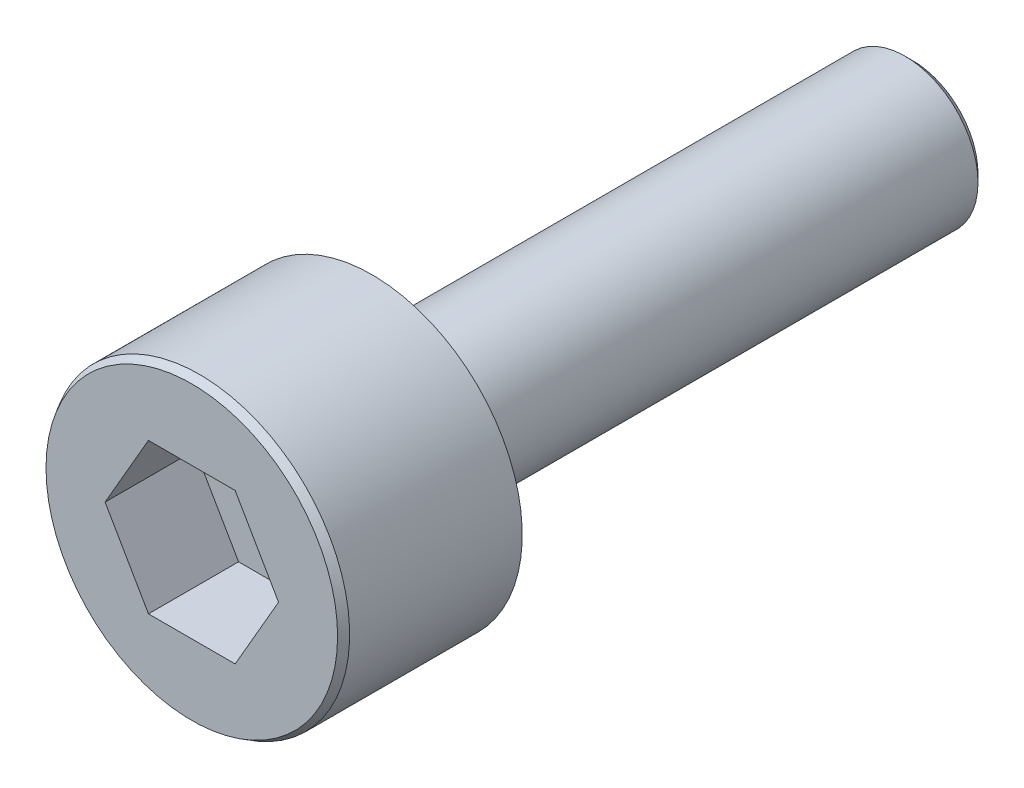
ISO-10303-21;
HEADER;
FILE_DESCRIPTION(('STEP AP214'),'2;1');
FILE_NAME('part.step','',(''),(''),'','','');
FILE_SCHEMA(('AUTOMOTIVE_DESIGN { 1 0 10303 214 1 1 1 1 }'));
ENDSEC;
DATA;
#1=APPLICATION_CONTEXT('core data for automotive mechanical design processes');
#2=APPLICATION_PROTOCOL_DEFINITION('international standard','automotive_design',2000,#1);
#3=PRODUCT_CONTEXT('',#1,'mechanical');
#4=PRODUCT('Part','Part','',(#3));
#5=PRODUCT_RELATED_PRODUCT_CATEGORY('part','',(#4));
#6=PRODUCT_DEFINITION_FORMATION('','',#4);
#7=PRODUCT_DEFINITION_CONTEXT('part definition',#1,'design');
#8=PRODUCT_DEFINITION('design','',#6,#7);
#9=PRODUCT_DEFINITION_SHAPE('','',#8);
#10=(LENGTH_UNIT() NAMED_UNIT(*) SI_UNIT(.MILLI.,.METRE.));
#11=(NAMED_UNIT(*) PLANE_ANGLE_UNIT() SI_UNIT($,.RADIAN.));
#12=(NAMED_UNIT(*) SI_UNIT($,.STERADIAN.) SOLID_ANGLE_UNIT());
#13=UNCERTAINTY_MEASURE_WITH_UNIT(LENGTH_MEASURE(1.E-05),#10,'distance_accuracy_value','');
#14=(GEOMETRIC_REPRESENTATION_CONTEXT(3) GLOBAL_UNCERTAINTY_ASSIGNED_CONTEXT((#13)) GLOBAL_UNIT_ASSIGNED_CONTEXT((#10,
#11,#12)) REPRESENTATION_CONTEXT('',''));
#15=CARTESIAN_POINT('',(0.,0.,0.));
#16=DIRECTION('',(0.,0.,1.));
#17=DIRECTION('',(1.,0.,0.));
#18=AXIS2_PLACEMENT_3D('',#15,#16,#17);
#19=CARTESIAN_POINT('',(2.88774570529282,0.00021534072567643,3.));
#20=DIRECTION('',(0.,0.,-1.));
#21=DIRECTION('',(-1.,0.,0.));
#22=AXIS2_PLACEMENT_3D('',#19,#20,#21);
#23=PLANE('',#22);
#24=DIRECTION('',(-1.,0.,0.));
#25=VECTOR('',#24,1.);
#26=CARTESIAN_POINT('',(1.4435,2.5,3.));
#27=LINE('',#26,#25);
#28=CARTESIAN_POINT('',(1.4435,2.5,3.));
#29=VERTEX_POINT('',#28);
#30=CARTESIAN_POINT('',(-1.4435,2.5,3.));
#31=VERTEX_POINT('',#30);
#32=EDGE_CURVE('E125',#29,#31,#27,.T.);
#33=ORIENTED_EDGE('',*,*,#32,.T.);
#34=DIRECTION('',(-0.499999999999998,-0.86602540378444,0.));
#35=VECTOR('',#34,1.);
#36=CARTESIAN_POINT('',(-1.4435,2.5,3.));
#37=LINE('',#36,#35);
#38=CARTESIAN_POINT('',(-2.88699999999999,-0.000215340725678899,3.));
#39=VERTEX_POINT('',#38);
#40=EDGE_CURVE('E130',#31,#39,#37,.T.);
#41=ORIENTED_EDGE('',*,*,#40,.T.);
#42=DIRECTION('',(0.500258297642127,-0.865876224203091,0.));
#43=VECTOR('',#42,1.);
#44=CARTESIAN_POINT('',(-2.88699999999999,-0.000215340725678953,3.));
#45=LINE('',#44,#43);
#46=CARTESIAN_POINT('',(-1.44275429470717,-2.5,3.));
#47=VERTEX_POINT('',#46);
#48=EDGE_CURVE('E134',#39,#47,#45,.T.);
#49=ORIENTED_EDGE('',*,*,#48,.T.);
#50=DIRECTION('',(1.,0.,0.));
#51=VECTOR('',#50,1.);
#52=CARTESIAN_POINT('',(-1.44275429470717,-2.5,3.));
#53=LINE('',#52,#51);
#54=CARTESIAN_POINT('',(1.44424570529282,-2.5,3.));
#55=VERTEX_POINT('',#54);
#56=EDGE_CURVE('E68',#47,#55,#53,.T.);
#57=ORIENTED_EDGE('',*,*,#56,.T.);
#58=DIRECTION('',(0.499999999999999,0.86602540378444,0.));
#59=VECTOR('',#58,1.);
#60=CARTESIAN_POINT('',(1.44424570529282,-2.5,3.));
#61=LINE('',#60,#59);
#62=CARTESIAN_POINT('',(2.88774570529282,0.000215340725676313,3.));
#63=VERTEX_POINT('',#62);
#64=EDGE_CURVE('E70',#55,#63,#61,.T.);
#65=ORIENTED_EDGE('',*,*,#64,.T.);
#66=DIRECTION('',(-0.500258297642127,0.865876224203091,0.));
#67=VECTOR('',#66,1.);
#68=CARTESIAN_POINT('',(2.88774570529282,0.000215340725676647,3.));
#69=LINE('',#68,#67);
#70=EDGE_CURVE('E72',#63,#29,#69,.T.);
#71=ORIENTED_EDGE('',*,*,#70,.T.);
#72=EDGE_LOOP('',(#33,#41,#49,#57,#65,#71));
#73=FACE_BOUND('',#72,.T.);
#74=ADVANCED_FACE('F17',(#73),#23,.F.);
#75=CARTESIAN_POINT('',(2.88774570529282,0.000215340725676647,3.));
#76=DIRECTION('',(0.865876224203091,0.500258297642127,0.));
#77=DIRECTION('',(-0.500258297642127,0.865876224203091,0.));
#78=AXIS2_PLACEMENT_3D('',#75,#76,#77);
#79=PLANE('',#78);
#80=DIRECTION('',(0.,0.,1.));
#81=VECTOR('',#80,1.);
#82=CARTESIAN_POINT('',(1.4435,2.5,3.));
#83=LINE('',#82,#81);
#84=CARTESIAN_POINT('',(1.4435,2.5,6.));
#85=VERTEX_POINT('',#84);
#86=EDGE_CURVE('E83',#85,#29,#83,.F.);
#87=ORIENTED_EDGE('',*,*,#86,.T.);
#88=ORIENTED_EDGE('',*,*,#70,.F.);
#89=DIRECTION('',(0.,0.,1.));
#90=VECTOR('',#89,1.);
#91=CARTESIAN_POINT('',(2.88774570529282,0.000215340725676864,3.));
#92=LINE('',#91,#90);
#93=CARTESIAN_POINT('',(2.88774570529282,0.000215340725676708,6.));
#94=VERTEX_POINT('',#93);
#95=EDGE_CURVE('E77',#63,#94,#92,.T.);
#96=ORIENTED_EDGE('',*,*,#95,.T.);
#97=DIRECTION('',(0.500258297642127,-0.865876224203091,0.));
#98=VECTOR('',#97,1.);
#99=CARTESIAN_POINT('',(1.4435,2.5,6.));
#100=LINE('',#99,#98);
#101=EDGE_CURVE('E122',#85,#94,#100,.T.);
#102=ORIENTED_EDGE('',*,*,#101,.F.);
#103=EDGE_LOOP('',(#87,#88,#96,#102));
#104=FACE_BOUND('',#103,.T.);
#105=ADVANCED_FACE('F80',(#104),#79,.F.);
#106=CARTESIAN_POINT('',(1.44424570529282,-2.5,3.));
#107=DIRECTION('',(0.86602540378444,-0.499999999999999,0.));
#108=DIRECTION('',(0.499999999999999,0.86602540378444,0.));
#109=AXIS2_PLACEMENT_3D('',#106,#107,#108);
#110=PLANE('',#109);
#111=ORIENTED_EDGE('',*,*,#95,.F.);
#112=ORIENTED_EDGE('',*,*,#64,.F.);
#113=DIRECTION('',(0.,0.,1.));
#114=VECTOR('',#113,1.);
#115=CARTESIAN_POINT('',(1.44424570529282,-2.5,3.));
#116=LINE('',#115,#114);
#117=CARTESIAN_POINT('',(1.44424570529282,-2.5,6.));
#118=VERTEX_POINT('',#117);
#119=EDGE_CURVE('E91',#55,#118,#116,.T.);
#120=ORIENTED_EDGE('',*,*,#119,.T.);
#121=DIRECTION('',(-0.499999999999998,-0.86602540378444,0.));
#122=VECTOR('',#121,1.);
#123=CARTESIAN_POINT('',(2.88774570529282,0.000215340725676647,6.));
#124=LINE('',#123,#122);
#125=EDGE_CURVE('E88',#94,#118,#124,.T.);
#126=ORIENTED_EDGE('',*,*,#125,.F.);
#127=EDGE_LOOP('',(#111,#112,#120,#126));
#128=FACE_BOUND('',#127,.T.);
#129=ADVANCED_FACE('F86',(#128),#110,.F.);
#130=CARTESIAN_POINT('',(-1.44275429470717,-2.5,3.));
#131=DIRECTION('',(0.,-1.,0.));
#132=DIRECTION('',(1.,0.,0.));
#133=AXIS2_PLACEMENT_3D('',#130,#131,#132);
#134=PLANE('',#133);
#135=ORIENTED_EDGE('',*,*,#119,.F.);
#136=ORIENTED_EDGE('',*,*,#56,.F.);
#137=DIRECTION('',(0.,0.,1.));
#138=VECTOR('',#137,1.);
#139=CARTESIAN_POINT('',(-1.44275429470717,-2.5,3.));
#140=LINE('',#139,#138);
#141=CARTESIAN_POINT('',(-1.44275429470717,-2.5,6.));
#142=VERTEX_POINT('',#141);
#143=EDGE_CURVE('E132',#47,#142,#140,.T.);
#144=ORIENTED_EDGE('',*,*,#143,.T.);
#145=DIRECTION('',(1.,0.,0.));
#146=VECTOR('',#145,1.);
#147=CARTESIAN_POINT('',(0.,-2.5,6.));
#148=LINE('',#147,#146);
#149=EDGE_CURVE('E118',#118,#142,#148,.F.);
#150=ORIENTED_EDGE('',*,*,#149,.F.);
#151=EDGE_LOOP('',(#135,#136,#144,#150));
#152=FACE_BOUND('',#151,.T.);
#153=ADVANCED_FACE('F137',(#152),#134,.F.);
#154=CARTESIAN_POINT('',(-2.88699999999999,-0.000215340725678953,3.));
#155=DIRECTION('',(-0.865876224203091,-0.500258297642127,0.));
#156=DIRECTION('',(0.500258297642127,-0.865876224203091,0.));
#157=AXIS2_PLACEMENT_3D('',#154,#155,#156);
#158=PLANE('',#157);
#159=ORIENTED_EDGE('',*,*,#143,.F.);
#160=ORIENTED_EDGE('',*,*,#48,.F.);
#161=DIRECTION('',(0.,0.,1.));
#162=VECTOR('',#161,1.);
#163=CARTESIAN_POINT('',(-2.88699999999999,-0.000215340725679032,3.));
#164=LINE('',#163,#162);
#165=CARTESIAN_POINT('',(-2.88699999999999,-0.000215340725679044,6.));
#166=VERTEX_POINT('',#165);
#167=EDGE_CURVE('E128',#39,#166,#164,.T.);
#168=ORIENTED_EDGE('',*,*,#167,.T.);
#169=DIRECTION('',(-0.500258297642127,0.865876224203091,0.));
#170=VECTOR('',#169,1.);
#171=CARTESIAN_POINT('',(-1.44275429470717,-2.5,6.));
#172=LINE('',#171,#170);
#173=EDGE_CURVE('E115',#142,#166,#172,.T.);
#174=ORIENTED_EDGE('',*,*,#173,.F.);
#175=EDGE_LOOP('',(#159,#160,#168,#174));
#176=FACE_BOUND('',#175,.T.);
#177=ADVANCED_FACE('F148',(#176),#158,.F.);
#178=CARTESIAN_POINT('',(-1.4435,2.5,3.));
#179=DIRECTION('',(-0.86602540378444,0.499999999999998,0.));
#180=DIRECTION('',(-0.499999999999998,-0.86602540378444,0.));
#181=AXIS2_PLACEMENT_3D('',#178,#179,#180);
#182=PLANE('',#181);
#183=ORIENTED_EDGE('',*,*,#167,.F.);
#184=ORIENTED_EDGE('',*,*,#40,.F.);
#185=DIRECTION('',(0.,0.,1.));
#186=VECTOR('',#185,1.);
#187=CARTESIAN_POINT('',(-1.4435,2.5,3.));
#188=LINE('',#187,#186);
#189=CARTESIAN_POINT('',(-1.4435,2.5,6.));
#190=VERTEX_POINT('',#189);
#191=EDGE_CURVE('E35',#31,#190,#188,.T.);
#192=ORIENTED_EDGE('',*,*,#191,.T.);
#193=DIRECTION('',(0.499999999999998,0.86602540378444,0.));
#194=VECTOR('',#193,1.);
#195=CARTESIAN_POINT('',(-2.88699999999999,-0.000215340725678953,6.));
#196=LINE('',#195,#194);
#197=EDGE_CURVE('E112',#166,#190,#196,.T.);
#198=ORIENTED_EDGE('',*,*,#197,.F.);
#199=EDGE_LOOP('',(#183,#184,#192,#198));
#200=FACE_BOUND('',#199,.T.);
#201=ADVANCED_FACE('F146',(#200),#182,.F.);
#202=CARTESIAN_POINT('',(1.4435,2.5,3.));
#203=DIRECTION('',(0.,1.,0.));
#204=DIRECTION('',(-1.,0.,0.));
#205=AXIS2_PLACEMENT_3D('',#202,#203,#204);
#206=PLANE('',#205);
#207=ORIENTED_EDGE('',*,*,#191,.F.);
#208=ORIENTED_EDGE('',*,*,#32,.F.);
#209=ORIENTED_EDGE('',*,*,#86,.F.);
#210=DIRECTION('',(1.,0.,0.));
#211=VECTOR('',#210,1.);
#212=CARTESIAN_POINT('',(0.,2.5,6.));
#213=LINE('',#212,#211);
#214=EDGE_CURVE('E107',#190,#85,#213,.T.);
#215=ORIENTED_EDGE('',*,*,#214,.F.);
#216=EDGE_LOOP('',(#207,#208,#209,#215));
#217=FACE_BOUND('',#216,.T.);
#218=ADVANCED_FACE('F143',(#217),#206,.F.);
#219=CARTESIAN_POINT('',(0.,0.,6.));
#220=DIRECTION('',(0.,0.,1.));
#221=DIRECTION('',(1.,0.,0.));
#222=AXIS2_PLACEMENT_3D('',#219,#220,#221);
#223=PLANE('',#222);
#224=CARTESIAN_POINT('',(0.,0.,5.99999999997181));
#225=DIRECTION('',(0.,0.,-1.));
#226=DIRECTION('',(-1.,0.,0.));
#227=AXIS2_PLACEMENT_3D('',#224,#225,#226);
#228=CIRCLE('',#227,4.85335303156815);
#229=CARTESIAN_POINT('',(-4.85335303156815,0.,5.99999999997181));
#230=VERTEX_POINT('',#229);
#231=EDGE_CURVE('E20',#230,#230,#228,.T.);
#232=ORIENTED_EDGE('',*,*,#231,.F.);
#233=EDGE_LOOP('',(#232));
#234=FACE_BOUND('',#233,.T.);
#235=ORIENTED_EDGE('',*,*,#197,.T.);
#236=ORIENTED_EDGE('',*,*,#214,.T.);
#237=ORIENTED_EDGE('',*,*,#101,.T.);
#238=ORIENTED_EDGE('',*,*,#125,.T.);
#239=ORIENTED_EDGE('',*,*,#149,.T.);
#240=ORIENTED_EDGE('',*,*,#173,.T.);
#241=EDGE_LOOP('',(#235,#236,#237,#238,#239,#240));
#242=FACE_BOUND('',#241,.T.);
#243=ADVANCED_FACE('F141',(#234,#242),#223,.T.);
#244=CARTESIAN_POINT('',(0.,0.,5.7460000001015));
#245=DIRECTION('',(0.,0.,-1.));
#246=DIRECTION('',(-1.,0.,0.));
#247=AXIS2_PLACEMENT_3D('',#244,#245,#246);
#248=CONICAL_SURFACE('',#247,4.99999999988177,0.523598775640608);
#249=ORIENTED_EDGE('',*,*,#231,.T.);
#250=EDGE_LOOP('',(#249));
#251=FACE_BOUND('',#250,.T.);
#252=CARTESIAN_POINT('',(0.,0.,5.746));
#253=DIRECTION('',(0.,0.,-1.));
#254=DIRECTION('',(-1.,0.,0.));
#255=AXIS2_PLACEMENT_3D('',#252,#253,#254);
#256=CIRCLE('',#255,5.);
#257=CARTESIAN_POINT('',(-5.,0.,5.746));
#258=VERTEX_POINT('',#257);
#259=EDGE_CURVE('E99',#258,#258,#256,.T.);
#260=ORIENTED_EDGE('',*,*,#259,.F.);
#261=EDGE_LOOP('',(#260));
#262=FACE_BOUND('',#261,.T.);
#263=ADVANCED_FACE('F180',(#251,#262),#248,.T.);
#264=CARTESIAN_POINT('',(0.,0.,-18.));
#265=DIRECTION('',(0.,0.,1.));
#266=DIRECTION('',(1.,0.,0.));
#267=AXIS2_PLACEMENT_3D('',#264,#265,#266);
#268=PLANE('',#267);
#269=CARTESIAN_POINT('',(0.,0.,-17.9999999999723));
#270=DIRECTION('',(0.,0.,1.));
#271=DIRECTION('',(1.,0.,0.));
#272=AXIS2_PLACEMENT_3D('',#269,#270,#271);
#273=CIRCLE('',#272,2.17100000003256);
#274=CARTESIAN_POINT('',(2.17100000003256,0.,-17.9999999999723));
#275=VERTEX_POINT('',#274);
#276=EDGE_CURVE('E97',#275,#275,#273,.T.);
#277=ORIENTED_EDGE('',*,*,#276,.F.);
#278=EDGE_LOOP('',(#277));
#279=FACE_BOUND('',#278,.T.);
#280=ADVANCED_FACE('F177',(#279),#268,.F.);
#281=CARTESIAN_POINT('',(0.,0.,6.));
#282=DIRECTION('',(0.,0.,-1.));
#283=DIRECTION('',(-1.,0.,0.));
#284=AXIS2_PLACEMENT_3D('',#281,#282,#283);
#285=CYLINDRICAL_SURFACE('',#284,5.);
#286=ORIENTED_EDGE('',*,*,#259,.T.);
#287=EDGE_LOOP('',(#286));
#288=FACE_BOUND('',#287,.T.);
#289=CARTESIAN_POINT('',(0.,0.,0.));
#290=DIRECTION('',(0.,0.,-1.));
#291=DIRECTION('',(-1.,0.,0.));
#292=AXIS2_PLACEMENT_3D('',#289,#290,#291);
#293=CIRCLE('',#292,5.);
#294=CARTESIAN_POINT('',(-5.,0.,0.));
#295=VERTEX_POINT('',#294);
#296=EDGE_CURVE('E95',#295,#295,#293,.F.);
#297=ORIENTED_EDGE('',*,*,#296,.T.);
#298=EDGE_LOOP('',(#297));
#299=FACE_BOUND('',#298,.T.);
#300=ADVANCED_FACE('F173',(#288,#299),#285,.T.);
#301=CARTESIAN_POINT('',(0.,0.,-17.7459999999314));
#302=DIRECTION('',(0.,0.,1.));
#303=DIRECTION('',(1.,0.,0.));
#304=AXIS2_PLACEMENT_3D('',#301,#302,#303);
#305=CONICAL_SURFACE('',#304,2.42500000001655,0.785398163285552);
#306=CARTESIAN_POINT('',(0.,0.,-17.746));
#307=DIRECTION('',(0.,0.,1.));
#308=DIRECTION('',(1.,0.,0.));
#309=AXIS2_PLACEMENT_3D('',#306,#307,#308);
#310=CIRCLE('',#309,2.425);
#311=CARTESIAN_POINT('',(2.425,0.,-17.746));
#312=VERTEX_POINT('',#311);
#313=EDGE_CURVE('E26',#312,#312,#310,.T.);
#314=ORIENTED_EDGE('',*,*,#313,.F.);
#315=EDGE_LOOP('',(#314));
#316=FACE_BOUND('',#315,.T.);
#317=ORIENTED_EDGE('',*,*,#276,.T.);
#318=EDGE_LOOP('',(#317));
#319=FACE_BOUND('',#318,.T.);
#320=ADVANCED_FACE('F166',(#316,#319),#305,.T.);
#321=CARTESIAN_POINT('',(0.,0.,0.));
#322=DIRECTION('',(0.,0.,1.));
#323=DIRECTION('',(1.,0.,0.));
#324=AXIS2_PLACEMENT_3D('',#321,#322,#323);
#325=PLANE('',#324);
#326=ORIENTED_EDGE('',*,*,#296,.F.);
#327=EDGE_LOOP('',(#326));
#328=FACE_BOUND('',#327,.T.);
#329=CARTESIAN_POINT('',(0.,0.,0.));
#330=DIRECTION('',(0.,0.,1.));
#331=DIRECTION('',(1.,0.,0.));
#332=AXIS2_PLACEMENT_3D('',#329,#330,#331);
#333=CIRCLE('',#332,2.425);
#334=CARTESIAN_POINT('',(2.425,0.,0.));
#335=VERTEX_POINT('',#334);
#336=EDGE_CURVE('E11',#335,#335,#333,.F.);
#337=ORIENTED_EDGE('',*,*,#336,.F.);
#338=EDGE_LOOP('',(#337));
#339=FACE_BOUND('',#338,.T.);
#340=ADVANCED_FACE('F160',(#328,#339),#325,.F.);
#341=CARTESIAN_POINT('',(0.,0.,-18.));
#342=DIRECTION('',(0.,0.,1.));
#343=DIRECTION('',(1.,0.,0.));
#344=AXIS2_PLACEMENT_3D('',#341,#342,#343);
#345=CYLINDRICAL_SURFACE('',#344,2.425);
#346=ORIENTED_EDGE('',*,*,#336,.T.);
#347=EDGE_LOOP('',(#346));
#348=FACE_BOUND('',#347,.T.);
#349=ORIENTED_EDGE('',*,*,#313,.T.);
#350=EDGE_LOOP('',(#349));
#351=FACE_BOUND('',#350,.T.);
#352=ADVANCED_FACE('F158',(#348,#351),#345,.T.);
#353=CLOSED_SHELL('',(#74,#105,#129,#153,#177,#201,#218,#243,#263,#280,#300,#320,#340,#352));
#354=MANIFOLD_SOLID_BREP('B1',#353);
#355=ADVANCED_BREP_SHAPE_REPRESENTATION('',(#18,#354),#14);
#356=SHAPE_DEFINITION_REPRESENTATION(#9,#355);
ENDSEC;
END-ISO-10303-21;
